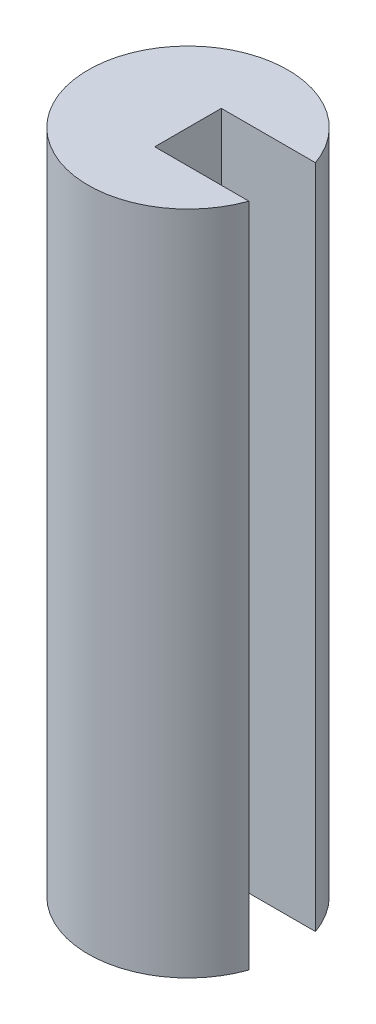
ISO-10303-21;
HEADER;
FILE_DESCRIPTION(('STEP AP214'),'2;1');
FILE_NAME('part.step','',(''),(''),'','','');
FILE_SCHEMA(('AUTOMOTIVE_DESIGN { 1 0 10303 214 1 1 1 1 }'));
ENDSEC;
DATA;
#1=APPLICATION_CONTEXT('core data for automotive mechanical design processes');
#2=APPLICATION_PROTOCOL_DEFINITION('international standard','automotive_design',2000,#1);
#3=PRODUCT_CONTEXT('',#1,'mechanical');
#4=PRODUCT('Part','Part','',(#3));
#5=PRODUCT_RELATED_PRODUCT_CATEGORY('part','',(#4));
#6=PRODUCT_DEFINITION_FORMATION('','',#4);
#7=PRODUCT_DEFINITION_CONTEXT('part definition',#1,'design');
#8=PRODUCT_DEFINITION('design','',#6,#7);
#9=PRODUCT_DEFINITION_SHAPE('','',#8);
#10=(LENGTH_UNIT() NAMED_UNIT(*) SI_UNIT(.MILLI.,.METRE.));
#11=(NAMED_UNIT(*) PLANE_ANGLE_UNIT() SI_UNIT($,.RADIAN.));
#12=(NAMED_UNIT(*) SI_UNIT($,.STERADIAN.) SOLID_ANGLE_UNIT());
#13=UNCERTAINTY_MEASURE_WITH_UNIT(LENGTH_MEASURE(1.E-05),#10,'distance_accuracy_value','');
#14=(GEOMETRIC_REPRESENTATION_CONTEXT(3) GLOBAL_UNCERTAINTY_ASSIGNED_CONTEXT((#13)) GLOBAL_UNIT_ASSIGNED_CONTEXT((#10,
#11,#12)) REPRESENTATION_CONTEXT('',''));
#15=CARTESIAN_POINT('',(0.,0.,0.));
#16=DIRECTION('',(0.,0.,1.));
#17=DIRECTION('',(1.,0.,0.));
#18=AXIS2_PLACEMENT_3D('',#15,#16,#17);
#19=CARTESIAN_POINT('',(0.,10.,0.));
#20=DIRECTION('',(0.,-1.,0.));
#21=DIRECTION('',(0.,0.,-1.));
#22=AXIS2_PLACEMENT_3D('',#19,#20,#21);
#23=CYLINDRICAL_SURFACE('',#22,1.5);
#24=CARTESIAN_POINT('',(0.,0.,0.));
#25=DIRECTION('',(0.,1.,0.));
#26=DIRECTION('',(0.,0.,1.));
#27=AXIS2_PLACEMENT_3D('',#24,#25,#26);
#28=CIRCLE('',#27,1.5);
#29=CARTESIAN_POINT('',(1.4142135623731,0.,-0.5));
#30=VERTEX_POINT('',#29);
#31=CARTESIAN_POINT('',(1.4142135623731,0.,0.5));
#32=VERTEX_POINT('',#31);
#33=EDGE_CURVE('E44',#30,#32,#28,.T.);
#34=ORIENTED_EDGE('',*,*,#33,.T.);
#35=DIRECTION('',(0.,-1.,0.));
#36=VECTOR('',#35,1.);
#37=CARTESIAN_POINT('',(1.4142135623731,10.,0.5));
#38=LINE('',#37,#36);
#39=CARTESIAN_POINT('',(1.4142135623731,10.,0.5));
#40=VERTEX_POINT('',#39);
#41=EDGE_CURVE('E93',#32,#40,#38,.F.);
#42=ORIENTED_EDGE('',*,*,#41,.T.);
#43=CARTESIAN_POINT('',(0.,10.,0.));
#44=DIRECTION('',(0.,1.,0.));
#45=DIRECTION('',(0.,0.,1.));
#46=AXIS2_PLACEMENT_3D('',#43,#44,#45);
#47=CIRCLE('',#46,1.5);
#48=CARTESIAN_POINT('',(1.4142135623731,10.,-0.5));
#49=VERTEX_POINT('',#48);
#50=EDGE_CURVE('E11',#49,#40,#47,.T.);
#51=ORIENTED_EDGE('',*,*,#50,.F.);
#52=DIRECTION('',(0.,-1.,0.));
#53=VECTOR('',#52,1.);
#54=CARTESIAN_POINT('',(1.4142135623731,10.,-0.5));
#55=LINE('',#54,#53);
#56=EDGE_CURVE('E106',#30,#49,#55,.F.);
#57=ORIENTED_EDGE('',*,*,#56,.F.);
#58=EDGE_LOOP('',(#34,#42,#51,#57));
#59=FACE_BOUND('',#58,.T.);
#60=ADVANCED_FACE('F41',(#59),#23,.T.);
#61=CARTESIAN_POINT('',(0.,10.,0.));
#62=DIRECTION('',(0.,1.,0.));
#63=DIRECTION('',(0.,0.,1.));
#64=AXIS2_PLACEMENT_3D('',#61,#62,#63);
#65=PLANE('',#64);
#66=DIRECTION('',(1.,0.,0.));
#67=VECTOR('',#66,1.);
#68=CARTESIAN_POINT('',(0.,10.,0.5));
#69=LINE('',#68,#67);
#70=CARTESIAN_POINT('',(0.,10.,0.5));
#71=VERTEX_POINT('',#70);
#72=EDGE_CURVE('E63',#71,#40,#69,.T.);
#73=ORIENTED_EDGE('',*,*,#72,.F.);
#74=DIRECTION('',(0.,0.,-1.));
#75=VECTOR('',#74,1.);
#76=CARTESIAN_POINT('',(0.,10.,0.));
#77=LINE('',#76,#75);
#78=CARTESIAN_POINT('',(0.,10.,-0.5));
#79=VERTEX_POINT('',#78);
#80=EDGE_CURVE('E87',#71,#79,#77,.T.);
#81=ORIENTED_EDGE('',*,*,#80,.T.);
#82=DIRECTION('',(1.,0.,0.));
#83=VECTOR('',#82,1.);
#84=CARTESIAN_POINT('',(0.,10.,-0.5));
#85=LINE('',#84,#83);
#86=EDGE_CURVE('E88',#79,#49,#85,.T.);
#87=ORIENTED_EDGE('',*,*,#86,.T.);
#88=ORIENTED_EDGE('',*,*,#50,.T.);
#89=EDGE_LOOP('',(#73,#81,#87,#88));
#90=FACE_BOUND('',#89,.T.);
#91=ADVANCED_FACE('F115',(#90),#65,.T.);
#92=CARTESIAN_POINT('',(0.,0.,0.));
#93=DIRECTION('',(0.,1.,0.));
#94=DIRECTION('',(0.,0.,1.));
#95=AXIS2_PLACEMENT_3D('',#92,#93,#94);
#96=PLANE('',#95);
#97=DIRECTION('',(0.,0.,-1.));
#98=VECTOR('',#97,1.);
#99=CARTESIAN_POINT('',(0.,0.,0.5));
#100=LINE('',#99,#98);
#101=CARTESIAN_POINT('',(0.,0.,0.5));
#102=VERTEX_POINT('',#101);
#103=CARTESIAN_POINT('',(0.,0.,-0.5));
#104=VERTEX_POINT('',#103);
#105=EDGE_CURVE('E84',#102,#104,#100,.T.);
#106=ORIENTED_EDGE('',*,*,#105,.F.);
#107=DIRECTION('',(1.,0.,0.));
#108=VECTOR('',#107,1.);
#109=CARTESIAN_POINT('',(0.,0.,0.5));
#110=LINE('',#109,#108);
#111=EDGE_CURVE('E91',#102,#32,#110,.T.);
#112=ORIENTED_EDGE('',*,*,#111,.T.);
#113=ORIENTED_EDGE('',*,*,#33,.F.);
#114=DIRECTION('',(1.,0.,0.));
#115=VECTOR('',#114,1.);
#116=CARTESIAN_POINT('',(0.,0.,-0.5));
#117=LINE('',#116,#115);
#118=EDGE_CURVE('E97',#104,#30,#117,.T.);
#119=ORIENTED_EDGE('',*,*,#118,.F.);
#120=EDGE_LOOP('',(#106,#112,#113,#119));
#121=FACE_BOUND('',#120,.T.);
#122=ADVANCED_FACE('F99',(#121),#96,.F.);
#123=CARTESIAN_POINT('',(0.,0.,0.5));
#124=DIRECTION('',(0.,0.,1.));
#125=DIRECTION('',(1.,0.,0.));
#126=AXIS2_PLACEMENT_3D('',#123,#124,#125);
#127=PLANE('',#126);
#128=ORIENTED_EDGE('',*,*,#111,.F.);
#129=DIRECTION('',(0.,1.,0.));
#130=VECTOR('',#129,1.);
#131=CARTESIAN_POINT('',(0.,0.,0.5));
#132=LINE('',#131,#130);
#133=EDGE_CURVE('E80',#102,#71,#132,.T.);
#134=ORIENTED_EDGE('',*,*,#133,.T.);
#135=ORIENTED_EDGE('',*,*,#72,.T.);
#136=ORIENTED_EDGE('',*,*,#41,.F.);
#137=EDGE_LOOP('',(#128,#134,#135,#136));
#138=FACE_BOUND('',#137,.T.);
#139=ADVANCED_FACE('F92',(#138),#127,.F.);
#140=CARTESIAN_POINT('',(0.,0.,-0.5));
#141=DIRECTION('',(0.,0.,1.));
#142=DIRECTION('',(1.,0.,0.));
#143=AXIS2_PLACEMENT_3D('',#140,#141,#142);
#144=PLANE('',#143);
#145=ORIENTED_EDGE('',*,*,#56,.T.);
#146=ORIENTED_EDGE('',*,*,#86,.F.);
#147=DIRECTION('',(0.,1.,0.));
#148=VECTOR('',#147,1.);
#149=CARTESIAN_POINT('',(0.,0.,-0.5));
#150=LINE('',#149,#148);
#151=EDGE_CURVE('E55',#104,#79,#150,.T.);
#152=ORIENTED_EDGE('',*,*,#151,.F.);
#153=ORIENTED_EDGE('',*,*,#118,.T.);
#154=EDGE_LOOP('',(#145,#146,#152,#153));
#155=FACE_BOUND('',#154,.T.);
#156=ADVANCED_FACE('F113',(#155),#144,.T.);
#157=CARTESIAN_POINT('',(0.,0.,0.5));
#158=DIRECTION('',(1.,0.,0.));
#159=DIRECTION('',(0.,0.,-1.));
#160=AXIS2_PLACEMENT_3D('',#157,#158,#159);
#161=PLANE('',#160);
#162=ORIENTED_EDGE('',*,*,#133,.F.);
#163=ORIENTED_EDGE('',*,*,#105,.T.);
#164=ORIENTED_EDGE('',*,*,#151,.T.);
#165=ORIENTED_EDGE('',*,*,#80,.F.);
#166=EDGE_LOOP('',(#162,#163,#164,#165));
#167=FACE_BOUND('',#166,.T.);
#168=ADVANCED_FACE('F82',(#167),#161,.T.);
#169=CLOSED_SHELL('',(#60,#91,#122,#139,#156,#168));
#170=MANIFOLD_SOLID_BREP('B2',#169);
#171=ADVANCED_BREP_SHAPE_REPRESENTATION('',(#18,#170),#14);
#172=SHAPE_DEFINITION_REPRESENTATION(#9,#171);
ENDSEC;
END-ISO-10303-21;
